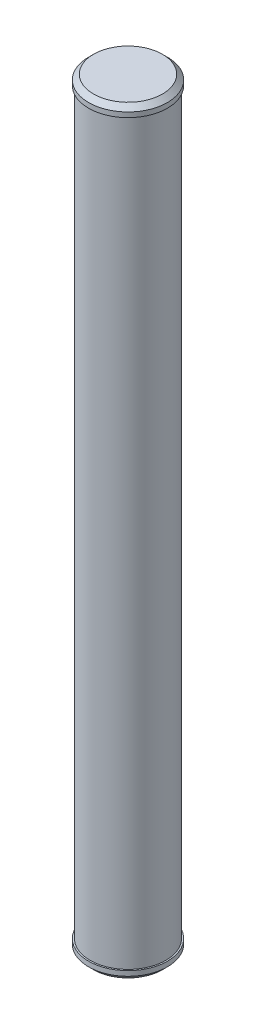
ISO-10303-21;
HEADER;
FILE_DESCRIPTION(('STEP AP214'),'2;1');
FILE_NAME('part.step','',(''),(''),'','','');
FILE_SCHEMA(('AUTOMOTIVE_DESIGN { 1 0 10303 214 1 1 1 1 }'));
ENDSEC;
DATA;
#1=APPLICATION_CONTEXT('core data for automotive mechanical design processes');
#2=APPLICATION_PROTOCOL_DEFINITION('international standard','automotive_design',2000,#1);
#3=PRODUCT_CONTEXT('',#1,'mechanical');
#4=PRODUCT('Part','Part','',(#3));
#5=PRODUCT_RELATED_PRODUCT_CATEGORY('part','',(#4));
#6=PRODUCT_DEFINITION_FORMATION('','',#4);
#7=PRODUCT_DEFINITION_CONTEXT('part definition',#1,'design');
#8=PRODUCT_DEFINITION('design','',#6,#7);
#9=PRODUCT_DEFINITION_SHAPE('','',#8);
#10=(LENGTH_UNIT() NAMED_UNIT(*) SI_UNIT(.MILLI.,.METRE.));
#11=(NAMED_UNIT(*) PLANE_ANGLE_UNIT() SI_UNIT($,.RADIAN.));
#12=(NAMED_UNIT(*) SI_UNIT($,.STERADIAN.) SOLID_ANGLE_UNIT());
#13=UNCERTAINTY_MEASURE_WITH_UNIT(LENGTH_MEASURE(1.E-05),#10,'distance_accuracy_value','');
#14=(GEOMETRIC_REPRESENTATION_CONTEXT(3) GLOBAL_UNCERTAINTY_ASSIGNED_CONTEXT((#13)) GLOBAL_UNIT_ASSIGNED_CONTEXT((#10,
#11,#12)) REPRESENTATION_CONTEXT('',''));
#15=CARTESIAN_POINT('',(0.,0.,0.));
#16=DIRECTION('',(0.,0.,1.));
#17=DIRECTION('',(1.,0.,0.));
#18=AXIS2_PLACEMENT_3D('',#15,#16,#17);
#19=CARTESIAN_POINT('',(0.,75.,0.));
#20=DIRECTION('',(0.,-1.,0.));
#21=DIRECTION('',(0.,0.,-1.));
#22=AXIS2_PLACEMENT_3D('',#19,#20,#21);
#23=CYLINDRICAL_SURFACE('',#22,3.85);
#24=CARTESIAN_POINT('',(0.,75.,0.));
#25=DIRECTION('',(0.,1.,0.));
#26=DIRECTION('',(0.,0.,1.));
#27=AXIS2_PLACEMENT_3D('',#24,#25,#26);
#28=CIRCLE('',#27,3.85);
#29=CARTESIAN_POINT('',(0.,75.,3.85));
#30=VERTEX_POINT('',#29);
#31=EDGE_CURVE('E62',#30,#30,#28,.T.);
#32=ORIENTED_EDGE('',*,*,#31,.F.);
#33=EDGE_LOOP('',(#32));
#34=FACE_BOUND('',#33,.T.);
#35=CARTESIAN_POINT('',(0.,0.,0.));
#36=DIRECTION('',(0.,1.,0.));
#37=DIRECTION('',(0.,0.,1.));
#38=AXIS2_PLACEMENT_3D('',#35,#36,#37);
#39=CIRCLE('',#38,3.85);
#40=CARTESIAN_POINT('',(0.,0.,3.85));
#41=VERTEX_POINT('',#40);
#42=EDGE_CURVE('E63',#41,#41,#39,.T.);
#43=ORIENTED_EDGE('',*,*,#42,.T.);
#44=EDGE_LOOP('',(#43));
#45=FACE_BOUND('',#44,.T.);
#46=ADVANCED_FACE('F41',(#34,#45),#23,.T.);
#47=CARTESIAN_POINT('',(0.,76.,0.));
#48=DIRECTION('',(0.,-1.,0.));
#49=DIRECTION('',(0.,0.,-1.));
#50=AXIS2_PLACEMENT_3D('',#47,#48,#49);
#51=CYLINDRICAL_SURFACE('',#50,4.);
#52=CARTESIAN_POINT('',(0.,75.5,0.));
#53=DIRECTION('',(0.,1.,0.));
#54=DIRECTION('',(0.,0.,1.));
#55=AXIS2_PLACEMENT_3D('',#52,#53,#54);
#56=CIRCLE('',#55,4.);
#57=CARTESIAN_POINT('',(0.,75.5,4.));
#58=VERTEX_POINT('',#57);
#59=EDGE_CURVE('E10',#58,#58,#56,.F.);
#60=ORIENTED_EDGE('',*,*,#59,.T.);
#61=EDGE_LOOP('',(#60));
#62=FACE_BOUND('',#61,.T.);
#63=CARTESIAN_POINT('',(0.,75.,0.));
#64=DIRECTION('',(0.,1.,0.));
#65=DIRECTION('',(0.,0.,1.));
#66=AXIS2_PLACEMENT_3D('',#63,#64,#65);
#67=CIRCLE('',#66,4.);
#68=CARTESIAN_POINT('',(0.,75.,4.));
#69=VERTEX_POINT('',#68);
#70=EDGE_CURVE('E66',#69,#69,#67,.T.);
#71=ORIENTED_EDGE('',*,*,#70,.T.);
#72=EDGE_LOOP('',(#71));
#73=FACE_BOUND('',#72,.T.);
#74=ADVANCED_FACE('F95',(#62,#73),#51,.T.);
#75=CARTESIAN_POINT('',(0.,76.,0.));
#76=DIRECTION('',(0.,1.,0.));
#77=DIRECTION('',(0.,0.,1.));
#78=AXIS2_PLACEMENT_3D('',#75,#76,#77);
#79=PLANE('',#78);
#80=CARTESIAN_POINT('',(0.,76.,0.));
#81=DIRECTION('',(0.,1.,0.));
#82=DIRECTION('',(0.,0.,1.));
#83=AXIS2_PLACEMENT_3D('',#80,#81,#82);
#84=CIRCLE('',#83,3.49999999999999);
#85=CARTESIAN_POINT('',(0.,76.,3.49999999999999));
#86=VERTEX_POINT('',#85);
#87=EDGE_CURVE('E49',#86,#86,#84,.T.);
#88=ORIENTED_EDGE('',*,*,#87,.T.);
#89=EDGE_LOOP('',(#88));
#90=FACE_BOUND('',#89,.T.);
#91=ADVANCED_FACE('F100',(#90),#79,.T.);
#92=CARTESIAN_POINT('',(0.,75.,0.));
#93=DIRECTION('',(0.,1.,0.));
#94=DIRECTION('',(0.,0.,1.));
#95=AXIS2_PLACEMENT_3D('',#92,#93,#94);
#96=PLANE('',#95);
#97=ORIENTED_EDGE('',*,*,#31,.T.);
#98=EDGE_LOOP('',(#97));
#99=FACE_BOUND('',#98,.T.);
#100=ORIENTED_EDGE('',*,*,#70,.F.);
#101=EDGE_LOOP('',(#100));
#102=FACE_BOUND('',#101,.T.);
#103=ADVANCED_FACE('F110',(#99,#102),#96,.F.);
#104=CARTESIAN_POINT('',(0.,-1.,0.));
#105=DIRECTION('',(0.,1.,0.));
#106=DIRECTION('',(0.,0.,1.));
#107=AXIS2_PLACEMENT_3D('',#104,#105,#106);
#108=CYLINDRICAL_SURFACE('',#107,4.);
#109=CARTESIAN_POINT('',(0.,-0.499999999999989,0.));
#110=DIRECTION('',(0.,-1.,0.));
#111=DIRECTION('',(0.,0.,-1.));
#112=AXIS2_PLACEMENT_3D('',#109,#110,#111);
#113=CIRCLE('',#112,4.);
#114=CARTESIAN_POINT('',(0.,-0.499999999999989,-4.));
#115=VERTEX_POINT('',#114);
#116=EDGE_CURVE('E53',#115,#115,#113,.F.);
#117=ORIENTED_EDGE('',*,*,#116,.T.);
#118=EDGE_LOOP('',(#117));
#119=FACE_BOUND('',#118,.T.);
#120=CARTESIAN_POINT('',(0.,0.,0.));
#121=DIRECTION('',(0.,-1.,0.));
#122=DIRECTION('',(0.,0.,-1.));
#123=AXIS2_PLACEMENT_3D('',#120,#121,#122);
#124=CIRCLE('',#123,4.);
#125=CARTESIAN_POINT('',(0.,0.,-4.));
#126=VERTEX_POINT('',#125);
#127=EDGE_CURVE('E67',#126,#126,#124,.T.);
#128=ORIENTED_EDGE('',*,*,#127,.T.);
#129=EDGE_LOOP('',(#128));
#130=FACE_BOUND('',#129,.T.);
#131=ADVANCED_FACE('F75',(#119,#130),#108,.T.);
#132=CARTESIAN_POINT('',(0.,-1.,0.));
#133=DIRECTION('',(0.,-1.,0.));
#134=DIRECTION('',(0.,0.,-1.));
#135=AXIS2_PLACEMENT_3D('',#132,#133,#134);
#136=PLANE('',#135);
#137=CARTESIAN_POINT('',(0.,-1.,0.));
#138=DIRECTION('',(0.,-1.,0.));
#139=DIRECTION('',(0.,0.,-1.));
#140=AXIS2_PLACEMENT_3D('',#137,#138,#139);
#141=CIRCLE('',#140,3.49999999999999);
#142=CARTESIAN_POINT('',(0.,-1.,-3.49999999999999));
#143=VERTEX_POINT('',#142);
#144=EDGE_CURVE('E57',#143,#143,#141,.T.);
#145=ORIENTED_EDGE('',*,*,#144,.T.);
#146=EDGE_LOOP('',(#145));
#147=FACE_BOUND('',#146,.T.);
#148=ADVANCED_FACE('F80',(#147),#136,.T.);
#149=CARTESIAN_POINT('',(0.,0.,0.));
#150=DIRECTION('',(0.,-1.,0.));
#151=DIRECTION('',(0.,0.,-1.));
#152=AXIS2_PLACEMENT_3D('',#149,#150,#151);
#153=PLANE('',#152);
#154=ORIENTED_EDGE('',*,*,#42,.F.);
#155=EDGE_LOOP('',(#154));
#156=FACE_BOUND('',#155,.T.);
#157=ORIENTED_EDGE('',*,*,#127,.F.);
#158=EDGE_LOOP('',(#157));
#159=FACE_BOUND('',#158,.T.);
#160=ADVANCED_FACE('F77',(#156,#159),#153,.F.);
#161=CARTESIAN_POINT('',(0.,-1.,0.));
#162=DIRECTION('',(0.,1.,0.));
#163=DIRECTION('',(0.,0.,1.));
#164=AXIS2_PLACEMENT_3D('',#161,#162,#163);
#165=CONICAL_SURFACE('',#164,3.49999999999999,0.785398163397448);
#166=ORIENTED_EDGE('',*,*,#116,.F.);
#167=EDGE_LOOP('',(#166));
#168=FACE_BOUND('',#167,.T.);
#169=ORIENTED_EDGE('',*,*,#144,.F.);
#170=EDGE_LOOP('',(#169));
#171=FACE_BOUND('',#170,.T.);
#172=ADVANCED_FACE('F79',(#168,#171),#165,.T.);
#173=CARTESIAN_POINT('',(0.,76.,0.));
#174=DIRECTION('',(0.,-1.,0.));
#175=DIRECTION('',(0.,0.,-1.));
#176=AXIS2_PLACEMENT_3D('',#173,#174,#175);
#177=CONICAL_SURFACE('',#176,3.49999999999999,0.785398163397445);
#178=ORIENTED_EDGE('',*,*,#59,.F.);
#179=EDGE_LOOP('',(#178));
#180=FACE_BOUND('',#179,.T.);
#181=ORIENTED_EDGE('',*,*,#87,.F.);
#182=EDGE_LOOP('',(#181));
#183=FACE_BOUND('',#182,.T.);
#184=ADVANCED_FACE('F44',(#180,#183),#177,.T.);
#185=CLOSED_SHELL('',(#46,#74,#91,#103,#131,#148,#160,#172,#184));
#186=MANIFOLD_SOLID_BREP('B2',#185);
#187=ADVANCED_BREP_SHAPE_REPRESENTATION('',(#18,#186),#14);
#188=SHAPE_DEFINITION_REPRESENTATION(#9,#187);
ENDSEC;
END-ISO-10303-21;
